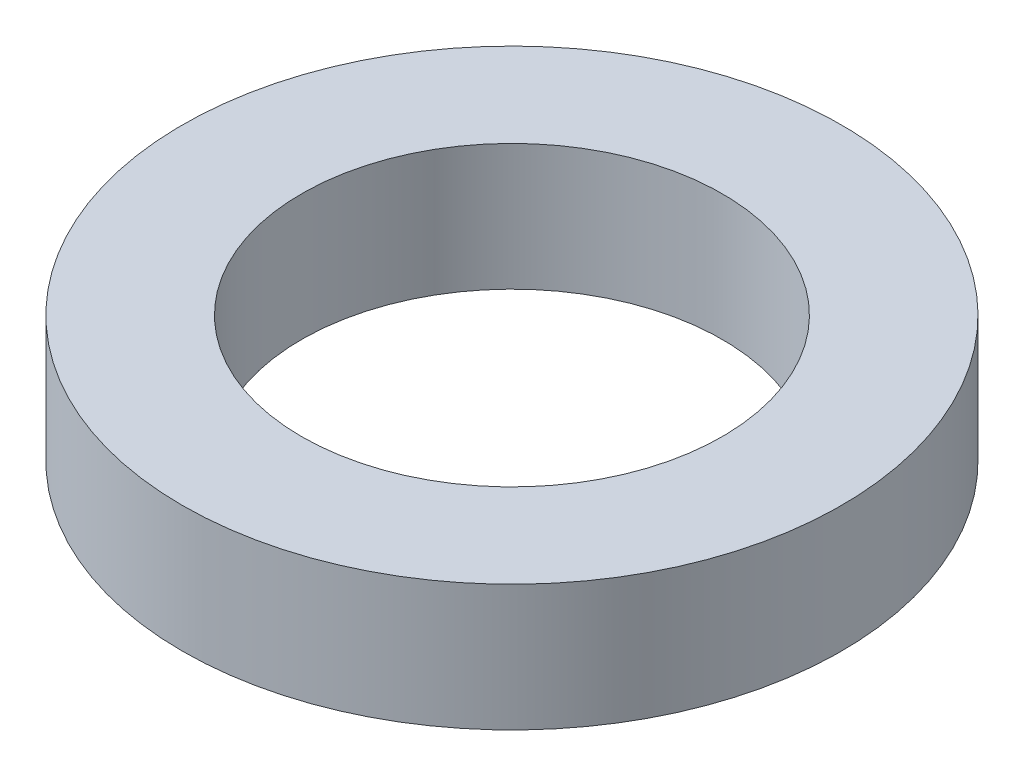
ISO-10303-21;
HEADER;
FILE_DESCRIPTION(('STEP AP214'),'2;1');
FILE_NAME('part.step','',(''),(''),'','','');
FILE_SCHEMA(('AUTOMOTIVE_DESIGN { 1 0 10303 214 1 1 1 1 }'));
ENDSEC;
DATA;
#1=APPLICATION_CONTEXT('core data for automotive mechanical design processes');
#2=APPLICATION_PROTOCOL_DEFINITION('international standard','automotive_design',2000,#1);
#3=PRODUCT_CONTEXT('',#1,'mechanical');
#4=PRODUCT('Part','Part','',(#3));
#5=PRODUCT_RELATED_PRODUCT_CATEGORY('part','',(#4));
#6=PRODUCT_DEFINITION_FORMATION('','',#4);
#7=PRODUCT_DEFINITION_CONTEXT('part definition',#1,'design');
#8=PRODUCT_DEFINITION('design','',#6,#7);
#9=PRODUCT_DEFINITION_SHAPE('','',#8);
#10=(LENGTH_UNIT() NAMED_UNIT(*) SI_UNIT(.MILLI.,.METRE.));
#11=(NAMED_UNIT(*) PLANE_ANGLE_UNIT() SI_UNIT($,.RADIAN.));
#12=(NAMED_UNIT(*) SI_UNIT($,.STERADIAN.) SOLID_ANGLE_UNIT());
#13=UNCERTAINTY_MEASURE_WITH_UNIT(LENGTH_MEASURE(1.E-05),#10,'distance_accuracy_value','');
#14=(GEOMETRIC_REPRESENTATION_CONTEXT(3) GLOBAL_UNCERTAINTY_ASSIGNED_CONTEXT((#13)) GLOBAL_UNIT_ASSIGNED_CONTEXT((#10,
#11,#12)) REPRESENTATION_CONTEXT('',''));
#15=CARTESIAN_POINT('',(0.,0.,0.));
#16=DIRECTION('',(0.,0.,1.));
#17=DIRECTION('',(1.,0.,0.));
#18=AXIS2_PLACEMENT_3D('',#15,#16,#17);
#19=CARTESIAN_POINT('',(0.,9.,0.));
#20=DIRECTION('',(0.,1.,0.));
#21=DIRECTION('',(0.,0.,1.));
#22=AXIS2_PLACEMENT_3D('',#19,#20,#21);
#23=PLANE('',#22);
#24=CARTESIAN_POINT('',(0.,9.,0.));
#25=DIRECTION('',(0.,1.,0.));
#26=DIRECTION('',(0.,0.,1.));
#27=AXIS2_PLACEMENT_3D('',#24,#25,#26);
#28=CIRCLE('',#27,23.5);
#29=CARTESIAN_POINT('',(0.,9.,23.5));
#30=VERTEX_POINT('',#29);
#31=EDGE_CURVE('E10',#30,#30,#28,.T.);
#32=ORIENTED_EDGE('',*,*,#31,.T.);
#33=EDGE_LOOP('',(#32));
#34=FACE_BOUND('',#33,.T.);
#35=CARTESIAN_POINT('',(0.,9.,0.));
#36=DIRECTION('',(0.,1.,0.));
#37=DIRECTION('',(0.,0.,1.));
#38=AXIS2_PLACEMENT_3D('',#35,#36,#37);
#39=CIRCLE('',#38,15.);
#40=CARTESIAN_POINT('',(0.,9.,15.));
#41=VERTEX_POINT('',#40);
#42=EDGE_CURVE('E54',#41,#41,#39,.T.);
#43=ORIENTED_EDGE('',*,*,#42,.F.);
#44=EDGE_LOOP('',(#43));
#45=FACE_BOUND('',#44,.T.);
#46=ADVANCED_FACE('F41',(#34,#45),#23,.T.);
#47=CARTESIAN_POINT('',(0.,0.,0.));
#48=DIRECTION('',(0.,1.,0.));
#49=DIRECTION('',(0.,0.,1.));
#50=AXIS2_PLACEMENT_3D('',#47,#48,#49);
#51=PLANE('',#50);
#52=CARTESIAN_POINT('',(0.,0.,0.));
#53=DIRECTION('',(0.,1.,0.));
#54=DIRECTION('',(0.,0.,1.));
#55=AXIS2_PLACEMENT_3D('',#52,#53,#54);
#56=CIRCLE('',#55,23.5);
#57=CARTESIAN_POINT('',(0.,0.,23.5));
#58=VERTEX_POINT('',#57);
#59=EDGE_CURVE('E45',#58,#58,#56,.T.);
#60=ORIENTED_EDGE('',*,*,#59,.F.);
#61=EDGE_LOOP('',(#60));
#62=FACE_BOUND('',#61,.T.);
#63=CARTESIAN_POINT('',(0.,0.,0.));
#64=DIRECTION('',(0.,1.,0.));
#65=DIRECTION('',(0.,0.,1.));
#66=AXIS2_PLACEMENT_3D('',#63,#64,#65);
#67=CIRCLE('',#66,15.);
#68=CARTESIAN_POINT('',(0.,0.,15.));
#69=VERTEX_POINT('',#68);
#70=EDGE_CURVE('E56',#69,#69,#67,.T.);
#71=ORIENTED_EDGE('',*,*,#70,.T.);
#72=EDGE_LOOP('',(#71));
#73=FACE_BOUND('',#72,.T.);
#74=ADVANCED_FACE('F68',(#62,#73),#51,.F.);
#75=CARTESIAN_POINT('',(0.,9.,0.));
#76=DIRECTION('',(0.,-1.,0.));
#77=DIRECTION('',(0.,0.,-1.));
#78=AXIS2_PLACEMENT_3D('',#75,#76,#77);
#79=CYLINDRICAL_SURFACE('',#78,23.5);
#80=ORIENTED_EDGE('',*,*,#31,.F.);
#81=EDGE_LOOP('',(#80));
#82=FACE_BOUND('',#81,.T.);
#83=ORIENTED_EDGE('',*,*,#59,.T.);
#84=EDGE_LOOP('',(#83));
#85=FACE_BOUND('',#84,.T.);
#86=ADVANCED_FACE('F43',(#82,#85),#79,.T.);
#87=CARTESIAN_POINT('',(0.,9.,0.));
#88=DIRECTION('',(0.,-1.,0.));
#89=DIRECTION('',(0.,0.,-1.));
#90=AXIS2_PLACEMENT_3D('',#87,#88,#89);
#91=CYLINDRICAL_SURFACE('',#90,15.);
#92=ORIENTED_EDGE('',*,*,#42,.T.);
#93=EDGE_LOOP('',(#92));
#94=FACE_BOUND('',#93,.T.);
#95=ORIENTED_EDGE('',*,*,#70,.F.);
#96=EDGE_LOOP('',(#95));
#97=FACE_BOUND('',#96,.T.);
#98=ADVANCED_FACE('F64',(#94,#97),#91,.F.);
#99=CLOSED_SHELL('',(#46,#74,#86,#98));
#100=MANIFOLD_SOLID_BREP('B2',#99);
#101=ADVANCED_BREP_SHAPE_REPRESENTATION('',(#18,#100),#14);
#102=SHAPE_DEFINITION_REPRESENTATION(#9,#101);
ENDSEC;
END-ISO-10303-21;
